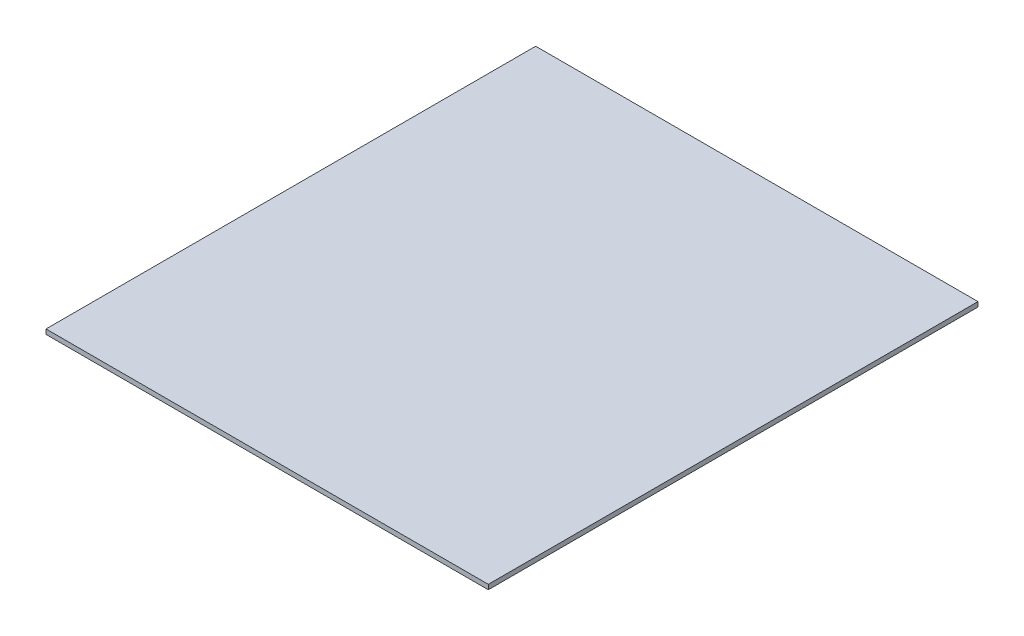
ISO-10303-21;
HEADER;
FILE_DESCRIPTION(('STEP AP214'),'2;1');
FILE_NAME('part.step','',(''),(''),'','','');
FILE_SCHEMA(('AUTOMOTIVE_DESIGN { 1 0 10303 214 1 1 1 1 }'));
ENDSEC;
DATA;
#1=APPLICATION_CONTEXT('core data for automotive mechanical design processes');
#2=APPLICATION_PROTOCOL_DEFINITION('international standard','automotive_design',2000,#1);
#3=PRODUCT_CONTEXT('',#1,'mechanical');
#4=PRODUCT('Part','Part','',(#3));
#5=PRODUCT_RELATED_PRODUCT_CATEGORY('part','',(#4));
#6=PRODUCT_DEFINITION_FORMATION('','',#4);
#7=PRODUCT_DEFINITION_CONTEXT('part definition',#1,'design');
#8=PRODUCT_DEFINITION('design','',#6,#7);
#9=PRODUCT_DEFINITION_SHAPE('','',#8);
#10=(LENGTH_UNIT() NAMED_UNIT(*) SI_UNIT(.MILLI.,.METRE.));
#11=(NAMED_UNIT(*) PLANE_ANGLE_UNIT() SI_UNIT($,.RADIAN.));
#12=(NAMED_UNIT(*) SI_UNIT($,.STERADIAN.) SOLID_ANGLE_UNIT());
#13=UNCERTAINTY_MEASURE_WITH_UNIT(LENGTH_MEASURE(1.E-05),#10,'distance_accuracy_value','');
#14=(GEOMETRIC_REPRESENTATION_CONTEXT(3) GLOBAL_UNCERTAINTY_ASSIGNED_CONTEXT((#13)) GLOBAL_UNIT_ASSIGNED_CONTEXT((#10,
#11,#12)) REPRESENTATION_CONTEXT('',''));
#15=CARTESIAN_POINT('',(0.,0.,0.));
#16=DIRECTION('',(0.,0.,1.));
#17=DIRECTION('',(1.,0.,0.));
#18=AXIS2_PLACEMENT_3D('',#15,#16,#17);
#19=CARTESIAN_POINT('',(140.,3.,-155.));
#20=DIRECTION('',(-1.,0.,0.));
#21=DIRECTION('',(0.,0.,1.));
#22=AXIS2_PLACEMENT_3D('',#19,#20,#21);
#23=PLANE('',#22);
#24=DIRECTION('',(0.,0.,-1.));
#25=VECTOR('',#24,1.);
#26=CARTESIAN_POINT('',(140.,0.,-155.));
#27=LINE('',#26,#25);
#28=CARTESIAN_POINT('',(140.,0.,155.));
#29=VERTEX_POINT('',#28);
#30=CARTESIAN_POINT('',(140.,0.,-155.));
#31=VERTEX_POINT('',#30);
#32=EDGE_CURVE('E107',#29,#31,#27,.T.);
#33=ORIENTED_EDGE('',*,*,#32,.T.);
#34=DIRECTION('',(0.,-1.,0.));
#35=VECTOR('',#34,1.);
#36=CARTESIAN_POINT('',(140.,3.,-155.));
#37=LINE('',#36,#35);
#38=CARTESIAN_POINT('',(140.,3.,-155.));
#39=VERTEX_POINT('',#38);
#40=EDGE_CURVE('E11',#39,#31,#37,.T.);
#41=ORIENTED_EDGE('',*,*,#40,.F.);
#42=DIRECTION('',(0.,0.,-1.));
#43=VECTOR('',#42,1.);
#44=CARTESIAN_POINT('',(140.,3.,-155.));
#45=LINE('',#44,#43);
#46=CARTESIAN_POINT('',(140.,3.,155.));
#47=VERTEX_POINT('',#46);
#48=EDGE_CURVE('E91',#47,#39,#45,.T.);
#49=ORIENTED_EDGE('',*,*,#48,.F.);
#50=DIRECTION('',(0.,-1.,0.));
#51=VECTOR('',#50,1.);
#52=CARTESIAN_POINT('',(140.,3.,155.));
#53=LINE('',#52,#51);
#54=EDGE_CURVE('E103',#47,#29,#53,.T.);
#55=ORIENTED_EDGE('',*,*,#54,.T.);
#56=EDGE_LOOP('',(#33,#41,#49,#55));
#57=FACE_BOUND('',#56,.T.);
#58=ADVANCED_FACE('F39',(#57),#23,.F.);
#59=CARTESIAN_POINT('',(-140.,3.,-155.));
#60=DIRECTION('',(0.,0.,1.));
#61=DIRECTION('',(1.,0.,0.));
#62=AXIS2_PLACEMENT_3D('',#59,#60,#61);
#63=PLANE('',#62);
#64=DIRECTION('',(-1.,0.,0.));
#65=VECTOR('',#64,1.);
#66=CARTESIAN_POINT('',(-140.,0.,-155.));
#67=LINE('',#66,#65);
#68=CARTESIAN_POINT('',(-140.,0.,-155.));
#69=VERTEX_POINT('',#68);
#70=EDGE_CURVE('E96',#31,#69,#67,.T.);
#71=ORIENTED_EDGE('',*,*,#70,.T.);
#72=DIRECTION('',(0.,-1.,0.));
#73=VECTOR('',#72,1.);
#74=CARTESIAN_POINT('',(-140.,3.,-155.));
#75=LINE('',#74,#73);
#76=CARTESIAN_POINT('',(-140.,3.,-155.));
#77=VERTEX_POINT('',#76);
#78=EDGE_CURVE('E48',#77,#69,#75,.T.);
#79=ORIENTED_EDGE('',*,*,#78,.F.);
#80=DIRECTION('',(-1.,0.,0.));
#81=VECTOR('',#80,1.);
#82=CARTESIAN_POINT('',(-140.,3.,-155.));
#83=LINE('',#82,#81);
#84=EDGE_CURVE('E86',#39,#77,#83,.T.);
#85=ORIENTED_EDGE('',*,*,#84,.F.);
#86=ORIENTED_EDGE('',*,*,#40,.T.);
#87=EDGE_LOOP('',(#71,#79,#85,#86));
#88=FACE_BOUND('',#87,.T.);
#89=ADVANCED_FACE('F95',(#88),#63,.F.);
#90=CARTESIAN_POINT('',(-140.,3.,-155.));
#91=DIRECTION('',(1.,0.,0.));
#92=DIRECTION('',(0.,0.,-1.));
#93=AXIS2_PLACEMENT_3D('',#90,#91,#92);
#94=PLANE('',#93);
#95=DIRECTION('',(0.,0.,1.));
#96=VECTOR('',#95,1.);
#97=CARTESIAN_POINT('',(-140.,0.,-155.));
#98=LINE('',#97,#96);
#99=CARTESIAN_POINT('',(-140.,0.,155.));
#100=VERTEX_POINT('',#99);
#101=EDGE_CURVE('E73',#69,#100,#98,.T.);
#102=ORIENTED_EDGE('',*,*,#101,.T.);
#103=DIRECTION('',(0.,-1.,0.));
#104=VECTOR('',#103,1.);
#105=CARTESIAN_POINT('',(-140.,3.,155.));
#106=LINE('',#105,#104);
#107=CARTESIAN_POINT('',(-140.,3.,155.));
#108=VERTEX_POINT('',#107);
#109=EDGE_CURVE('E98',#108,#100,#106,.T.);
#110=ORIENTED_EDGE('',*,*,#109,.F.);
#111=DIRECTION('',(0.,0.,1.));
#112=VECTOR('',#111,1.);
#113=CARTESIAN_POINT('',(-140.,3.,-155.));
#114=LINE('',#113,#112);
#115=EDGE_CURVE('E89',#77,#108,#114,.T.);
#116=ORIENTED_EDGE('',*,*,#115,.F.);
#117=ORIENTED_EDGE('',*,*,#78,.T.);
#118=EDGE_LOOP('',(#102,#110,#116,#117));
#119=FACE_BOUND('',#118,.T.);
#120=ADVANCED_FACE('F99',(#119),#94,.F.);
#121=CARTESIAN_POINT('',(-140.,3.,155.));
#122=DIRECTION('',(0.,0.,-1.));
#123=DIRECTION('',(-1.,0.,0.));
#124=AXIS2_PLACEMENT_3D('',#121,#122,#123);
#125=PLANE('',#124);
#126=DIRECTION('',(1.,0.,0.));
#127=VECTOR('',#126,1.);
#128=CARTESIAN_POINT('',(-140.,0.,155.));
#129=LINE('',#128,#127);
#130=EDGE_CURVE('E79',#100,#29,#129,.T.);
#131=ORIENTED_EDGE('',*,*,#130,.T.);
#132=ORIENTED_EDGE('',*,*,#54,.F.);
#133=DIRECTION('',(1.,0.,0.));
#134=VECTOR('',#133,1.);
#135=CARTESIAN_POINT('',(-140.,3.,155.));
#136=LINE('',#135,#134);
#137=EDGE_CURVE('E56',#108,#47,#136,.T.);
#138=ORIENTED_EDGE('',*,*,#137,.F.);
#139=ORIENTED_EDGE('',*,*,#109,.T.);
#140=EDGE_LOOP('',(#131,#132,#138,#139));
#141=FACE_BOUND('',#140,.T.);
#142=ADVANCED_FACE('F120',(#141),#125,.F.);
#143=CARTESIAN_POINT('',(0.,3.,0.));
#144=DIRECTION('',(0.,1.,0.));
#145=DIRECTION('',(0.,0.,1.));
#146=AXIS2_PLACEMENT_3D('',#143,#144,#145);
#147=PLANE('',#146);
#148=ORIENTED_EDGE('',*,*,#48,.T.);
#149=ORIENTED_EDGE('',*,*,#84,.T.);
#150=ORIENTED_EDGE('',*,*,#115,.T.);
#151=ORIENTED_EDGE('',*,*,#137,.T.);
#152=EDGE_LOOP('',(#148,#149,#150,#151));
#153=FACE_BOUND('',#152,.T.);
#154=ADVANCED_FACE('F87',(#153),#147,.T.);
#155=CARTESIAN_POINT('',(0.,0.,0.));
#156=DIRECTION('',(0.,1.,0.));
#157=DIRECTION('',(0.,0.,1.));
#158=AXIS2_PLACEMENT_3D('',#155,#156,#157);
#159=PLANE('',#158);
#160=ORIENTED_EDGE('',*,*,#32,.F.);
#161=ORIENTED_EDGE('',*,*,#130,.F.);
#162=ORIENTED_EDGE('',*,*,#101,.F.);
#163=ORIENTED_EDGE('',*,*,#70,.F.);
#164=EDGE_LOOP('',(#160,#161,#162,#163));
#165=FACE_BOUND('',#164,.T.);
#166=ADVANCED_FACE('F123',(#165),#159,.F.);
#167=CLOSED_SHELL('',(#58,#89,#120,#142,#154,#166));
#168=MANIFOLD_SOLID_BREP('B2',#167);
#169=ADVANCED_BREP_SHAPE_REPRESENTATION('',(#18,#168),#14);
#170=SHAPE_DEFINITION_REPRESENTATION(#9,#169);
ENDSEC;
END-ISO-10303-21;
